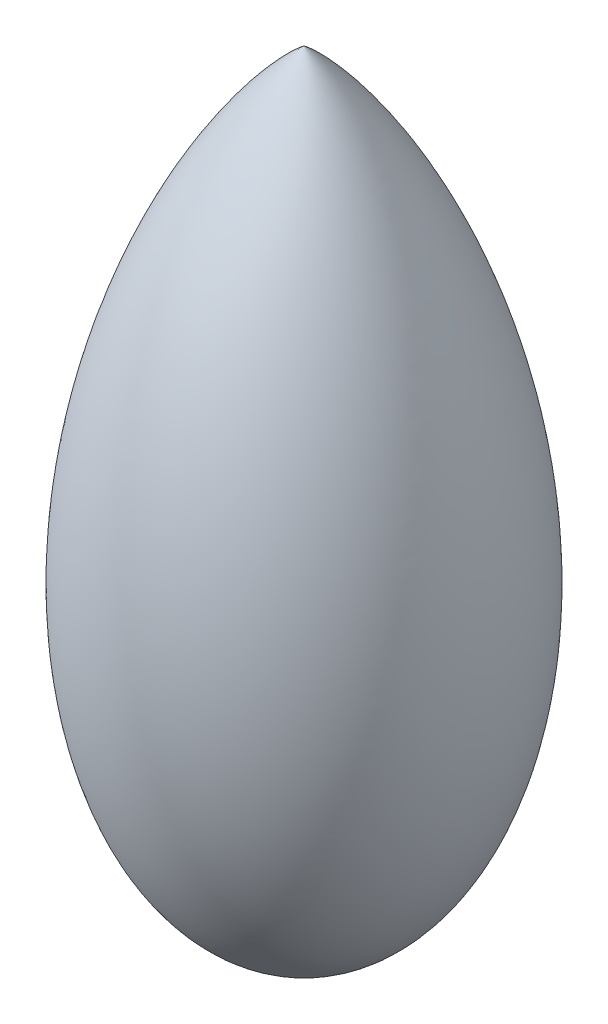
ISO-10303-21;
HEADER;
FILE_DESCRIPTION(('STEP AP214'),'2;1');
FILE_NAME('part.step','',(''),(''),'','','');
FILE_SCHEMA(('AUTOMOTIVE_DESIGN { 1 0 10303 214 1 1 1 1 }'));
ENDSEC;
DATA;
#1=APPLICATION_CONTEXT('core data for automotive mechanical design processes');
#2=APPLICATION_PROTOCOL_DEFINITION('international standard','automotive_design',2000,#1);
#3=PRODUCT_CONTEXT('',#1,'mechanical');
#4=PRODUCT('Part','Part','',(#3));
#5=PRODUCT_RELATED_PRODUCT_CATEGORY('part','',(#4));
#6=PRODUCT_DEFINITION_FORMATION('','',#4);
#7=PRODUCT_DEFINITION_CONTEXT('part definition',#1,'design');
#8=PRODUCT_DEFINITION('design','',#6,#7);
#9=PRODUCT_DEFINITION_SHAPE('','',#8);
#10=(LENGTH_UNIT() NAMED_UNIT(*) SI_UNIT(.MILLI.,.METRE.));
#11=(NAMED_UNIT(*) PLANE_ANGLE_UNIT() SI_UNIT($,.RADIAN.));
#12=(NAMED_UNIT(*) SI_UNIT($,.STERADIAN.) SOLID_ANGLE_UNIT());
#13=UNCERTAINTY_MEASURE_WITH_UNIT(LENGTH_MEASURE(1.E-05),#10,'distance_accuracy_value','');
#14=(GEOMETRIC_REPRESENTATION_CONTEXT(3) GLOBAL_UNCERTAINTY_ASSIGNED_CONTEXT((#13)) GLOBAL_UNIT_ASSIGNED_CONTEXT((#10,
#11,#12)) REPRESENTATION_CONTEXT('',''));
#15=CARTESIAN_POINT('',(0.,0.,0.));
#16=DIRECTION('',(0.,0.,1.));
#17=DIRECTION('',(1.,0.,0.));
#18=AXIS2_PLACEMENT_3D('',#15,#16,#17);
#19=CARTESIAN_POINT('',(-3.18160596551925E-10,-397.887357729739,0.));
#20=CARTESIAN_POINT('',(0.0876504563904565,-397.887357729739,0.));
#21=CARTESIAN_POINT('',(0.455246439323767,-397.886468376197,0.));
#22=CARTESIAN_POINT('',(1.23162692503277,-397.878338216358,0.));
#23=CARTESIAN_POINT('',(2.17816795492282,-397.85014010203,0.));
#24=CARTESIAN_POINT('',(3.42580082338765,-397.790228454526,0.));
#25=CARTESIAN_POINT('',(4.61694574441913,-397.704522118945,0.));
#26=CARTESIAN_POINT('',(5.8372099096875,-397.593127933542,0.));
#27=CARTESIAN_POINT('',(7.03680046975008,-397.456186465257,0.));
#28=CARTESIAN_POINT('',(8.24326881354219,-397.293864905155,0.));
#29=CARTESIAN_POINT('',(9.74070403642557,-397.059490697206,0.));
#30=CARTESIAN_POINT('',(11.5323435921975,-396.728331741206,0.));
#31=CARTESIAN_POINT('',(14.1993788228932,-396.139454654907,0.));
#32=CARTESIAN_POINT('',(17.1251078448229,-395.325351156734,0.));
#33=CARTESIAN_POINT('',(20.00306167225,-394.358372910581,0.));
#34=CARTESIAN_POINT('',(22.8275552870454,-393.246661374221,0.));
#35=CARTESIAN_POINT('',(25.0522772715719,-392.273842316122,0.));
#36=CARTESIAN_POINT('',(27.2404080284615,-391.221084751251,0.));
#37=CARTESIAN_POINT('',(29.3900091673878,-390.091943787361,0.));
#38=CARTESIAN_POINT('',(31.4997849788266,-388.889992927602,0.));
#39=CARTESIAN_POINT('',(33.5685065388073,-387.618775275836,0.));
#40=CARTESIAN_POINT('',(35.806800371351,-386.14228218634,0.));
#41=CARTESIAN_POINT('',(38.1979295205893,-384.440415498137,0.));
#42=CARTESIAN_POINT('',(41.4045621989811,-381.968292232635,0.));
#43=CARTESIAN_POINT('',(45.3949781887864,-378.533936735467,0.));
#44=CARTESIAN_POINT('',(49.8451997328688,-374.177288751914,0.));
#45=CARTESIAN_POINT('',(54.6128617558829,-368.797656252933,0.));
#46=CARTESIAN_POINT('',(59.0791765708193,-363.039031310991,0.));
#47=CARTESIAN_POINT('',(63.2465695725189,-356.94800101845,0.));
#48=CARTESIAN_POINT('',(67.1177629586468,-350.555675947556,0.));
#49=CARTESIAN_POINT('',(70.6527151593706,-343.971914028209,0.));
#50=CARTESIAN_POINT('',(73.8696440192901,-337.227704026216,0.));
#51=CARTESIAN_POINT('',(76.7536827100675,-330.436353023047,0.));
#52=CARTESIAN_POINT('',(79.3312978323709,-323.622876862487,0.));
#53=CARTESIAN_POINT('',(81.6520570285523,-316.717900074025,0.));
#54=CARTESIAN_POINT('',(83.7279596472421,-309.735584110901,0.));
#55=CARTESIAN_POINT('',(85.5699578131044,-302.68808515525,0.));
#56=CARTESIAN_POINT('',(87.1880795300196,-295.585972247842,0.));
#57=CARTESIAN_POINT('',(88.942263810361,-286.65152246637,0.));
#58=CARTESIAN_POINT('',(90.634475607638,-275.855522596578,0.));
#59=CARTESIAN_POINT('',(92.0398463543524,-263.182278757286,0.));
#60=CARTESIAN_POINT('',(92.916574192383,-248.637066331278,0.));
#61=CARTESIAN_POINT('',(93.1535113171598,-230.424773429299,0.));
#62=CARTESIAN_POINT('',(92.1347610441264,-208.583371905416,0.));
#63=CARTESIAN_POINT('',(89.1749268947525,-183.237650127363,0.));
#64=CARTESIAN_POINT('',(83.5256085425216,-154.629371503166,0.));
#65=CARTESIAN_POINT('',(75.7142629698706,-126.535499634635,0.));
#66=CARTESIAN_POINT('',(65.7943584916801,-99.1143486196402,0.));
#67=CARTESIAN_POINT('',(55.2691219539122,-75.8686972192706,0.));
#68=CARTESIAN_POINT('',(44.8868051032124,-56.6252039829437,0.));
#69=CARTESIAN_POINT('',(36.2317154672219,-42.7031826375667,0.));
#70=CARTESIAN_POINT('',(30.0759734769353,-33.6745616475581,0.));
#71=CARTESIAN_POINT('',(24.6703567724537,-26.3478237188819,0.));
#72=CARTESIAN_POINT('',(20.7321581462809,-21.336474857701,0.));
#73=CARTESIAN_POINT('',(17.237624132657,-17.1374379781833,0.));
#74=CARTESIAN_POINT('',(14.2224594020669,-13.6930057563079,0.));
#75=CARTESIAN_POINT('',(11.7336664479238,-10.9647244342948,0.));
#76=CARTESIAN_POINT('',(9.48856143117925,-8.6140836467625,0.));
#77=CARTESIAN_POINT('',(7.50503651166222,-6.6264277595999,0.));
#78=CARTESIAN_POINT('',(5.81919546230837,-5.00368188602272,0.));
#79=CARTESIAN_POINT('',(4.44884280338863,-3.72835762372999,0.));
#80=CARTESIAN_POINT('',(3.12338180727249,-2.54192336814065,0.));
#81=CARTESIAN_POINT('',(1.98538799992224,-1.56719715100692,0.));
#82=CARTESIAN_POINT('',(1.11538786524937,-0.855424104387772,0.));
#83=CARTESIAN_POINT('',(0.525671322615955,-0.392426362562673,0.));
#84=CARTESIAN_POINT('',(0.226996678456167,-0.165878191205637,0.));
#85=CARTESIAN_POINT('',(0.0759431183166673,-0.0549189067636391,0.));
#86=CARTESIAN_POINT('',(0.,0.,0.));
#87=B_SPLINE_CURVE_WITH_KNOTS('',4,(#19,#20,#21,#22,#23,#24,#25,#26,#27,#28,#29,#30,#31,#32,#33,
#34,#35,#36,#37,#38,#39,#40,#41,#42,#43,#44,#45,#46,#47,#48,#49,#50,#51,#52,#53,#54,#55,#56,#57,
#58,#59,#60,#61,#62,#63,#64,#65,#66,#67,#68,#69,#70,#71,#72,#73,#74,#75,#76,#77,#78,#79,#80,#81,
#82,#83,#84,#85,#86),.UNSPECIFIED.,.F.,.F.,(5,1,1,1,1,1,1,1,1,1,1,1,1,1,1,1,1,1,1,1,1,1,1,1,1,1,
1,1,1,1,1,1,1,1,1,1,1,1,1,1,1,1,1,1,1,1,1,1,1,1,1,1,1,1,1,1,1,1,1,1,1,1,1,1,5),(0.,
0.000754004804656705,0.00315938997927523,0.00556477515389364,0.00797016032851217,
0.0103755455031307,0.0127809306777492,0.0151863158523677,0.0175917010269863,0.0199970862016048,
0.0248078501139453,0.0296186140262856,0.0392401418509665,0.0440509213389743,0.048861700826982,
0.0536724803149898,0.0584832598029976,0.0632940770893701,0.0681048943757425,0.0729157116621151,
0.0777265289484875,0.0845451585888202,0.0913637882291529,0.105001047509818,0.119433355983627,
0.133865664457436,0.148297964287333,0.16273026411723,0.177902333107707,0.193074402098184,
0.207506746820802,0.22193909154342,0.236371436266038,0.250803780988657,0.265236179496005,
0.279668578003354,0.294100976510703,0.308533375018051,0.337398102681039,0.366262830344026,
0.395127612891473,0.423992395438919,0.481721926972363,0.539451476743425,0.597181026294302,
0.654910573922178,0.712640073793555,0.77036960007663,0.799234329837761,0.828099059598893,
0.842531441759112,0.856963823919332,0.871396206079551,0.878612397159661,0.885828588239771,
0.893247469982135,0.900666351724498,0.904375792595681,0.908085233466863,0.911794674338045,
0.915504115209226,0.9184754871816,0.919961173167786,0.92070401616088,0.921446859153973),.UNSPECIFIED.);
#88=CARTESIAN_POINT('',(0.,0.,0.));
#89=DIRECTION('',(0.,1.,0.));
#90=AXIS1_PLACEMENT('',#88,#89);
#91=SURFACE_OF_REVOLUTION('',#87,#90);
#92=CARTESIAN_POINT('',(0.,0.,0.));
#93=VERTEX_POINT('',#92);
#94=VERTEX_LOOP('',#93);
#95=FACE_BOUND('',#94,.T.);
#96=CARTESIAN_POINT('',(0.,-397.887357729739,0.));
#97=VERTEX_POINT('',#96);
#98=VERTEX_LOOP('',#97);
#99=FACE_BOUND('',#98,.T.);
#100=ADVANCED_FACE('F40',(#95,#99),#91,.T.);
#101=CLOSED_SHELL('',(#100));
#102=MANIFOLD_SOLID_BREP('B2',#101);
#103=ADVANCED_BREP_SHAPE_REPRESENTATION('',(#18,#102),#14);
#104=SHAPE_DEFINITION_REPRESENTATION(#9,#103);
ENDSEC;
END-ISO-10303-21;
